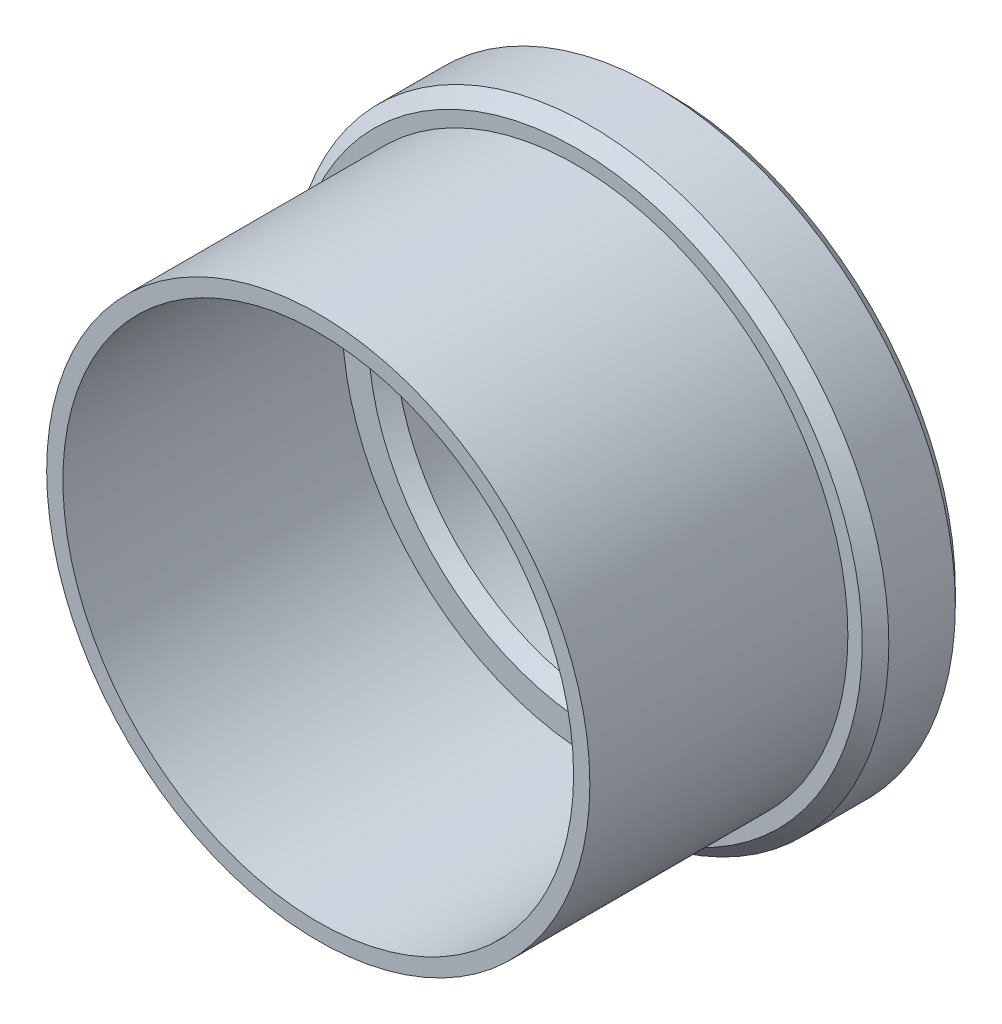
ISO-10303-21;
HEADER;
FILE_DESCRIPTION(('STEP AP214'),'2;1');
FILE_NAME('part.step','',(''),(''),'','','');
FILE_SCHEMA(('AUTOMOTIVE_DESIGN { 1 0 10303 214 1 1 1 1 }'));
ENDSEC;
DATA;
#1=APPLICATION_CONTEXT('core data for automotive mechanical design processes');
#2=APPLICATION_PROTOCOL_DEFINITION('international standard','automotive_design',2000,#1);
#3=PRODUCT_CONTEXT('',#1,'mechanical');
#4=PRODUCT('Part','Part','',(#3));
#5=PRODUCT_RELATED_PRODUCT_CATEGORY('part','',(#4));
#6=PRODUCT_DEFINITION_FORMATION('','',#4);
#7=PRODUCT_DEFINITION_CONTEXT('part definition',#1,'design');
#8=PRODUCT_DEFINITION('design','',#6,#7);
#9=PRODUCT_DEFINITION_SHAPE('','',#8);
#10=(LENGTH_UNIT() NAMED_UNIT(*) SI_UNIT(.MILLI.,.METRE.));
#11=(NAMED_UNIT(*) PLANE_ANGLE_UNIT() SI_UNIT($,.RADIAN.));
#12=(NAMED_UNIT(*) SI_UNIT($,.STERADIAN.) SOLID_ANGLE_UNIT());
#13=UNCERTAINTY_MEASURE_WITH_UNIT(LENGTH_MEASURE(1.E-05),#10,'distance_accuracy_value','');
#14=(GEOMETRIC_REPRESENTATION_CONTEXT(3) GLOBAL_UNCERTAINTY_ASSIGNED_CONTEXT((#13)) GLOBAL_UNIT_ASSIGNED_CONTEXT((#10,
#11,#12)) REPRESENTATION_CONTEXT('',''));
#15=CARTESIAN_POINT('',(0.,0.,0.));
#16=DIRECTION('',(0.,0.,1.));
#17=DIRECTION('',(1.,0.,0.));
#18=AXIS2_PLACEMENT_3D('',#15,#16,#17);
#19=CARTESIAN_POINT('',(0.,10.21,0.));
#20=DIRECTION('',(0.,0.,-1.));
#21=DIRECTION('',(-1.,0.,0.));
#22=AXIS2_PLACEMENT_3D('',#19,#20,#21);
#23=PLANE('',#22);
#24=CARTESIAN_POINT('',(0.,0.,0.));
#25=DIRECTION('',(0.,0.,1.));
#26=DIRECTION('',(1.,0.,0.));
#27=AXIS2_PLACEMENT_3D('',#24,#25,#26);
#28=CIRCLE('',#27,9.6);
#29=CARTESIAN_POINT('',(9.6,0.,0.));
#30=VERTEX_POINT('',#29);
#31=EDGE_CURVE('E10',#30,#30,#28,.T.);
#32=ORIENTED_EDGE('',*,*,#31,.F.);
#33=EDGE_LOOP('',(#32));
#34=FACE_BOUND('',#33,.T.);
#35=CARTESIAN_POINT('',(0.,0.,0.));
#36=DIRECTION('',(0.,0.,1.));
#37=DIRECTION('',(1.,0.,0.));
#38=AXIS2_PLACEMENT_3D('',#35,#36,#37);
#39=CIRCLE('',#38,10.21);
#40=CARTESIAN_POINT('',(10.21,0.,0.));
#41=VERTEX_POINT('',#40);
#42=EDGE_CURVE('E69',#41,#41,#39,.T.);
#43=ORIENTED_EDGE('',*,*,#42,.T.);
#44=EDGE_LOOP('',(#43));
#45=FACE_BOUND('',#44,.T.);
#46=ADVANCED_FACE('F32',(#34,#45),#23,.F.);
#47=CARTESIAN_POINT('',(0.,0.,0.));
#48=DIRECTION('',(0.,0.,1.));
#49=DIRECTION('',(1.,0.,0.));
#50=AXIS2_PLACEMENT_3D('',#47,#48,#49);
#51=CYLINDRICAL_SURFACE('',#50,9.6);
#52=CARTESIAN_POINT('',(0.,0.,-10.5));
#53=DIRECTION('',(0.,0.,1.));
#54=DIRECTION('',(1.,0.,0.));
#55=AXIS2_PLACEMENT_3D('',#52,#53,#54);
#56=CIRCLE('',#55,9.6);
#57=CARTESIAN_POINT('',(9.6,0.,-10.5));
#58=VERTEX_POINT('',#57);
#59=EDGE_CURVE('E38',#58,#58,#56,.T.);
#60=ORIENTED_EDGE('',*,*,#59,.F.);
#61=EDGE_LOOP('',(#60));
#62=FACE_BOUND('',#61,.T.);
#63=ORIENTED_EDGE('',*,*,#31,.T.);
#64=EDGE_LOOP('',(#63));
#65=FACE_BOUND('',#64,.T.);
#66=ADVANCED_FACE('F124',(#62,#65),#51,.F.);
#67=CARTESIAN_POINT('',(0.,9.6,-10.5));
#68=DIRECTION('',(0.,0.,-1.));
#69=DIRECTION('',(-1.,0.,0.));
#70=AXIS2_PLACEMENT_3D('',#67,#68,#69);
#71=PLANE('',#70);
#72=CARTESIAN_POINT('',(0.,0.,-10.5));
#73=DIRECTION('',(0.,0.,1.));
#74=DIRECTION('',(1.,0.,0.));
#75=AXIS2_PLACEMENT_3D('',#72,#73,#74);
#76=CIRCLE('',#75,8.625);
#77=CARTESIAN_POINT('',(8.625,0.,-10.5));
#78=VERTEX_POINT('',#77);
#79=EDGE_CURVE('E42',#78,#78,#76,.T.);
#80=ORIENTED_EDGE('',*,*,#79,.F.);
#81=EDGE_LOOP('',(#80));
#82=FACE_BOUND('',#81,.T.);
#83=ORIENTED_EDGE('',*,*,#59,.T.);
#84=EDGE_LOOP('',(#83));
#85=FACE_BOUND('',#84,.T.);
#86=ADVANCED_FACE('F119',(#82,#85),#71,.F.);
#87=CARTESIAN_POINT('',(0.,0.,-10.5));
#88=DIRECTION('',(0.,0.,1.));
#89=DIRECTION('',(1.,0.,0.));
#90=AXIS2_PLACEMENT_3D('',#87,#88,#89);
#91=CONICAL_SURFACE('',#90,8.625,0.785398163397448);
#92=CARTESIAN_POINT('',(0.,0.,-11.));
#93=DIRECTION('',(0.,0.,1.));
#94=DIRECTION('',(1.,0.,0.));
#95=AXIS2_PLACEMENT_3D('',#92,#93,#94);
#96=CIRCLE('',#95,8.125);
#97=CARTESIAN_POINT('',(8.125,0.,-11.));
#98=VERTEX_POINT('',#97);
#99=EDGE_CURVE('E46',#98,#98,#96,.T.);
#100=ORIENTED_EDGE('',*,*,#99,.F.);
#101=EDGE_LOOP('',(#100));
#102=FACE_BOUND('',#101,.T.);
#103=ORIENTED_EDGE('',*,*,#79,.T.);
#104=EDGE_LOOP('',(#103));
#105=FACE_BOUND('',#104,.T.);
#106=ADVANCED_FACE('F113',(#102,#105),#91,.F.);
#107=CARTESIAN_POINT('',(0.,0.,0.));
#108=DIRECTION('',(0.,0.,1.));
#109=DIRECTION('',(1.,0.,0.));
#110=AXIS2_PLACEMENT_3D('',#107,#108,#109);
#111=CYLINDRICAL_SURFACE('',#110,8.125);
#112=CARTESIAN_POINT('',(0.,0.,-13.2));
#113=DIRECTION('',(0.,0.,1.));
#114=DIRECTION('',(1.,0.,0.));
#115=AXIS2_PLACEMENT_3D('',#112,#113,#114);
#116=CIRCLE('',#115,8.125);
#117=CARTESIAN_POINT('',(8.125,0.,-13.2));
#118=VERTEX_POINT('',#117);
#119=EDGE_CURVE('E51',#118,#118,#116,.T.);
#120=ORIENTED_EDGE('',*,*,#119,.F.);
#121=EDGE_LOOP('',(#120));
#122=FACE_BOUND('',#121,.T.);
#123=ORIENTED_EDGE('',*,*,#99,.T.);
#124=EDGE_LOOP('',(#123));
#125=FACE_BOUND('',#124,.T.);
#126=ADVANCED_FACE('F107',(#122,#125),#111,.F.);
#127=CARTESIAN_POINT('',(0.,10.75,-13.2));
#128=DIRECTION('',(0.,0.,1.));
#129=DIRECTION('',(1.,0.,0.));
#130=AXIS2_PLACEMENT_3D('',#127,#128,#129);
#131=PLANE('',#130);
#132=CARTESIAN_POINT('',(0.,0.,-13.2));
#133=DIRECTION('',(0.,0.,1.));
#134=DIRECTION('',(1.,0.,0.));
#135=AXIS2_PLACEMENT_3D('',#132,#133,#134);
#136=CIRCLE('',#135,10.75);
#137=CARTESIAN_POINT('',(10.75,0.,-13.2));
#138=VERTEX_POINT('',#137);
#139=EDGE_CURVE('E54',#138,#138,#136,.T.);
#140=ORIENTED_EDGE('',*,*,#139,.F.);
#141=EDGE_LOOP('',(#140));
#142=FACE_BOUND('',#141,.T.);
#143=ORIENTED_EDGE('',*,*,#119,.T.);
#144=EDGE_LOOP('',(#143));
#145=FACE_BOUND('',#144,.T.);
#146=ADVANCED_FACE('F101',(#142,#145),#131,.F.);
#147=CARTESIAN_POINT('',(0.,0.,-13.2));
#148=DIRECTION('',(0.,0.,1.));
#149=DIRECTION('',(1.,0.,0.));
#150=AXIS2_PLACEMENT_3D('',#147,#148,#149);
#151=CONICAL_SURFACE('',#150,10.75,0.785398163397447);
#152=CARTESIAN_POINT('',(0.,0.,-12.7));
#153=DIRECTION('',(0.,0.,1.));
#154=DIRECTION('',(1.,0.,0.));
#155=AXIS2_PLACEMENT_3D('',#152,#153,#154);
#156=CIRCLE('',#155,11.25);
#157=CARTESIAN_POINT('',(11.25,0.,-12.7));
#158=VERTEX_POINT('',#157);
#159=EDGE_CURVE('E57',#158,#158,#156,.T.);
#160=ORIENTED_EDGE('',*,*,#159,.F.);
#161=EDGE_LOOP('',(#160));
#162=FACE_BOUND('',#161,.T.);
#163=ORIENTED_EDGE('',*,*,#139,.T.);
#164=EDGE_LOOP('',(#163));
#165=FACE_BOUND('',#164,.T.);
#166=ADVANCED_FACE('F95',(#162,#165),#151,.T.);
#167=CARTESIAN_POINT('',(0.,0.,0.));
#168=DIRECTION('',(0.,0.,1.));
#169=DIRECTION('',(1.,0.,0.));
#170=AXIS2_PLACEMENT_3D('',#167,#168,#169);
#171=CYLINDRICAL_SURFACE('',#170,11.25);
#172=CARTESIAN_POINT('',(0.,0.,-10.2));
#173=DIRECTION('',(0.,0.,1.));
#174=DIRECTION('',(1.,0.,0.));
#175=AXIS2_PLACEMENT_3D('',#172,#173,#174);
#176=CIRCLE('',#175,11.25);
#177=CARTESIAN_POINT('',(11.25,0.,-10.2));
#178=VERTEX_POINT('',#177);
#179=EDGE_CURVE('E60',#178,#178,#176,.T.);
#180=ORIENTED_EDGE('',*,*,#179,.F.);
#181=EDGE_LOOP('',(#180));
#182=FACE_BOUND('',#181,.T.);
#183=ORIENTED_EDGE('',*,*,#159,.T.);
#184=EDGE_LOOP('',(#183));
#185=FACE_BOUND('',#184,.T.);
#186=ADVANCED_FACE('F89',(#182,#185),#171,.T.);
#187=CARTESIAN_POINT('',(0.,0.,-10.2));
#188=DIRECTION('',(0.,0.,-1.));
#189=DIRECTION('',(-1.,0.,0.));
#190=AXIS2_PLACEMENT_3D('',#187,#188,#189);
#191=CONICAL_SURFACE('',#190,11.25,0.785398163397447);
#192=CARTESIAN_POINT('',(0.,0.,-9.7));
#193=DIRECTION('',(0.,0.,1.));
#194=DIRECTION('',(1.,0.,0.));
#195=AXIS2_PLACEMENT_3D('',#192,#193,#194);
#196=CIRCLE('',#195,10.75);
#197=CARTESIAN_POINT('',(10.75,0.,-9.7));
#198=VERTEX_POINT('',#197);
#199=EDGE_CURVE('E63',#198,#198,#196,.T.);
#200=ORIENTED_EDGE('',*,*,#199,.F.);
#201=EDGE_LOOP('',(#200));
#202=FACE_BOUND('',#201,.T.);
#203=ORIENTED_EDGE('',*,*,#179,.T.);
#204=EDGE_LOOP('',(#203));
#205=FACE_BOUND('',#204,.T.);
#206=ADVANCED_FACE('F83',(#202,#205),#191,.T.);
#207=CARTESIAN_POINT('',(0.,10.75,-9.7));
#208=DIRECTION('',(0.,0.,-1.));
#209=DIRECTION('',(-1.,0.,0.));
#210=AXIS2_PLACEMENT_3D('',#207,#208,#209);
#211=PLANE('',#210);
#212=CARTESIAN_POINT('',(0.,0.,-9.7));
#213=DIRECTION('',(0.,0.,1.));
#214=DIRECTION('',(1.,0.,0.));
#215=AXIS2_PLACEMENT_3D('',#212,#213,#214);
#216=CIRCLE('',#215,10.21);
#217=CARTESIAN_POINT('',(10.21,0.,-9.7));
#218=VERTEX_POINT('',#217);
#219=EDGE_CURVE('E66',#218,#218,#216,.T.);
#220=ORIENTED_EDGE('',*,*,#219,.F.);
#221=EDGE_LOOP('',(#220));
#222=FACE_BOUND('',#221,.T.);
#223=ORIENTED_EDGE('',*,*,#199,.T.);
#224=EDGE_LOOP('',(#223));
#225=FACE_BOUND('',#224,.T.);
#226=ADVANCED_FACE('F77',(#222,#225),#211,.F.);
#227=CARTESIAN_POINT('',(0.,0.,0.));
#228=DIRECTION('',(0.,0.,1.));
#229=DIRECTION('',(1.,0.,0.));
#230=AXIS2_PLACEMENT_3D('',#227,#228,#229);
#231=CYLINDRICAL_SURFACE('',#230,10.21);
#232=ORIENTED_EDGE('',*,*,#42,.F.);
#233=EDGE_LOOP('',(#232));
#234=FACE_BOUND('',#233,.T.);
#235=ORIENTED_EDGE('',*,*,#219,.T.);
#236=EDGE_LOOP('',(#235));
#237=FACE_BOUND('',#236,.T.);
#238=ADVANCED_FACE('F74',(#234,#237),#231,.T.);
#239=CLOSED_SHELL('',(#46,#66,#86,#106,#126,#146,#166,#186,#206,#226,#238));
#240=MANIFOLD_SOLID_BREP('B2',#239);
#241=ADVANCED_BREP_SHAPE_REPRESENTATION('',(#18,#240),#14);
#242=SHAPE_DEFINITION_REPRESENTATION(#9,#241);
ENDSEC;
END-ISO-10303-21;
